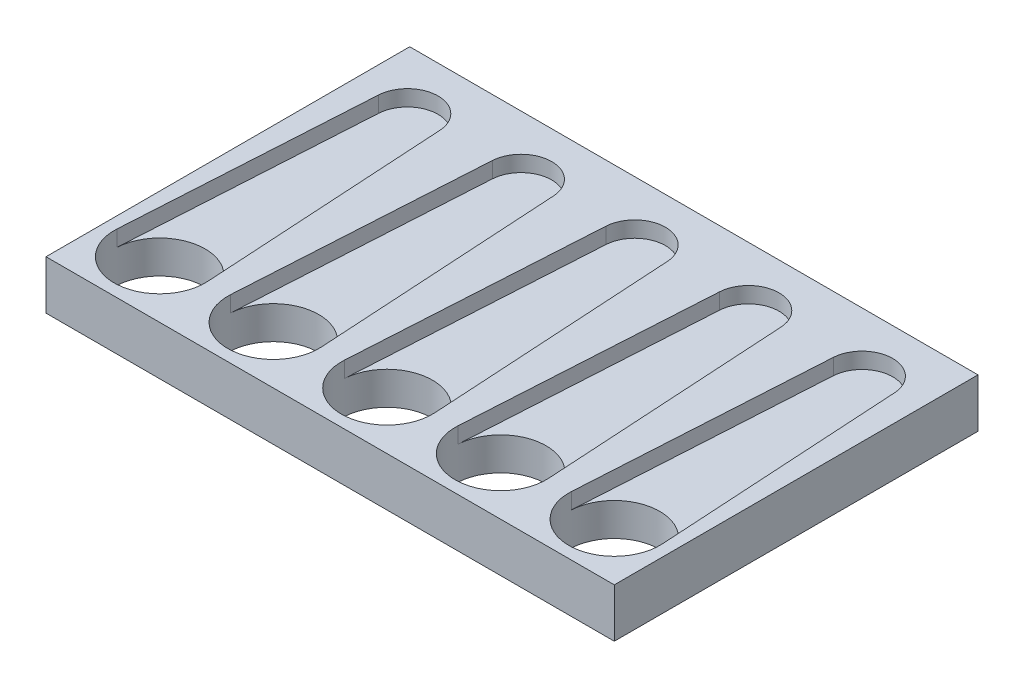
ISO-10303-21;
HEADER;
FILE_DESCRIPTION(('STEP AP214'),'2;1');
FILE_NAME('part.step','',(''),(''),'','','');
FILE_SCHEMA(('AUTOMOTIVE_DESIGN { 1 0 10303 214 1 1 1 1 }'));
ENDSEC;
DATA;
#1=APPLICATION_CONTEXT('core data for automotive mechanical design processes');
#2=APPLICATION_PROTOCOL_DEFINITION('international standard','automotive_design',2000,#1);
#3=PRODUCT_CONTEXT('',#1,'mechanical');
#4=PRODUCT('Part','Part','',(#3));
#5=PRODUCT_RELATED_PRODUCT_CATEGORY('part','',(#4));
#6=PRODUCT_DEFINITION_FORMATION('','',#4);
#7=PRODUCT_DEFINITION_CONTEXT('part definition',#1,'design');
#8=PRODUCT_DEFINITION('design','',#6,#7);
#9=PRODUCT_DEFINITION_SHAPE('','',#8);
#10=(LENGTH_UNIT() NAMED_UNIT(*) SI_UNIT(.MILLI.,.METRE.));
#11=(NAMED_UNIT(*) PLANE_ANGLE_UNIT() SI_UNIT($,.RADIAN.));
#12=(NAMED_UNIT(*) SI_UNIT($,.STERADIAN.) SOLID_ANGLE_UNIT());
#13=UNCERTAINTY_MEASURE_WITH_UNIT(LENGTH_MEASURE(1.E-05),#10,'distance_accuracy_value','');
#14=(GEOMETRIC_REPRESENTATION_CONTEXT(3) GLOBAL_UNCERTAINTY_ASSIGNED_CONTEXT((#13)) GLOBAL_UNIT_ASSIGNED_CONTEXT((#10,
#11,#12)) REPRESENTATION_CONTEXT('',''));
#15=CARTESIAN_POINT('',(0.,0.,0.));
#16=DIRECTION('',(0.,0.,1.));
#17=DIRECTION('',(1.,0.,0.));
#18=AXIS2_PLACEMENT_3D('',#15,#16,#17);
#19=CARTESIAN_POINT('',(0.,1.4,0.));
#20=DIRECTION('',(0.,0.,-1.));
#21=DIRECTION('',(-1.,0.,0.));
#22=AXIS2_PLACEMENT_3D('',#19,#20,#21);
#23=PLANE('',#22);
#24=DIRECTION('',(1.,0.,0.));
#25=VECTOR('',#24,1.);
#26=CARTESIAN_POINT('',(0.,-2.9,0.));
#27=LINE('',#26,#25);
#28=CARTESIAN_POINT('',(0.,-2.9,0.));
#29=VERTEX_POINT('',#28);
#30=CARTESIAN_POINT('',(50.,-2.9,0.));
#31=VERTEX_POINT('',#30);
#32=EDGE_CURVE('E207',#29,#31,#27,.T.);
#33=ORIENTED_EDGE('',*,*,#32,.T.);
#34=DIRECTION('',(0.,-1.,0.));
#35=VECTOR('',#34,1.);
#36=CARTESIAN_POINT('',(50.,1.4,0.));
#37=LINE('',#36,#35);
#38=CARTESIAN_POINT('',(50.,1.4,0.));
#39=VERTEX_POINT('',#38);
#40=EDGE_CURVE('E211',#39,#31,#37,.T.);
#41=ORIENTED_EDGE('',*,*,#40,.F.);
#42=DIRECTION('',(1.,0.,0.));
#43=VECTOR('',#42,1.);
#44=CARTESIAN_POINT('',(0.,1.4,0.));
#45=LINE('',#44,#43);
#46=CARTESIAN_POINT('',(0.,1.4,0.));
#47=VERTEX_POINT('',#46);
#48=EDGE_CURVE('E465',#47,#39,#45,.T.);
#49=ORIENTED_EDGE('',*,*,#48,.F.);
#50=DIRECTION('',(0.,-1.,0.));
#51=VECTOR('',#50,1.);
#52=CARTESIAN_POINT('',(0.,1.4,0.));
#53=LINE('',#52,#51);
#54=EDGE_CURVE('E61',#47,#29,#53,.T.);
#55=ORIENTED_EDGE('',*,*,#54,.T.);
#56=EDGE_LOOP('',(#33,#41,#49,#55));
#57=FACE_BOUND('',#56,.T.);
#58=ADVANCED_FACE('F51',(#57),#23,.F.);
#59=CARTESIAN_POINT('',(0.,1.4,-32.));
#60=DIRECTION('',(0.,0.,-1.));
#61=DIRECTION('',(-1.,0.,0.));
#62=AXIS2_PLACEMENT_3D('',#59,#60,#61);
#63=PLANE('',#62);
#64=DIRECTION('',(0.,-1.,0.));
#65=VECTOR('',#64,1.);
#66=CARTESIAN_POINT('',(50.,1.4,-32.));
#67=LINE('',#66,#65);
#68=CARTESIAN_POINT('',(50.,1.4,-32.));
#69=VERTEX_POINT('',#68);
#70=CARTESIAN_POINT('',(50.,-2.9,-32.));
#71=VERTEX_POINT('',#70);
#72=EDGE_CURVE('E228',#69,#71,#67,.T.);
#73=ORIENTED_EDGE('',*,*,#72,.T.);
#74=DIRECTION('',(1.,0.,0.));
#75=VECTOR('',#74,1.);
#76=CARTESIAN_POINT('',(0.,-2.9,-32.));
#77=LINE('',#76,#75);
#78=CARTESIAN_POINT('',(0.,-2.9,-32.));
#79=VERTEX_POINT('',#78);
#80=EDGE_CURVE('E216',#79,#71,#77,.T.);
#81=ORIENTED_EDGE('',*,*,#80,.F.);
#82=DIRECTION('',(0.,-1.,0.));
#83=VECTOR('',#82,1.);
#84=CARTESIAN_POINT('',(0.,1.4,-32.));
#85=LINE('',#84,#83);
#86=CARTESIAN_POINT('',(0.,1.4,-32.));
#87=VERTEX_POINT('',#86);
#88=EDGE_CURVE('E11',#87,#79,#85,.T.);
#89=ORIENTED_EDGE('',*,*,#88,.F.);
#90=DIRECTION('',(1.,0.,0.));
#91=VECTOR('',#90,1.);
#92=CARTESIAN_POINT('',(0.,1.4,-32.));
#93=LINE('',#92,#91);
#94=EDGE_CURVE('E466',#87,#69,#93,.T.);
#95=ORIENTED_EDGE('',*,*,#94,.T.);
#96=EDGE_LOOP('',(#73,#81,#89,#95));
#97=FACE_BOUND('',#96,.T.);
#98=ADVANCED_FACE('F565',(#97),#63,.T.);
#99=CARTESIAN_POINT('',(5.,1.4,-26.8));
#100=DIRECTION('',(0.,-1.,0.));
#101=DIRECTION('',(0.,0.,-1.));
#102=AXIS2_PLACEMENT_3D('',#99,#100,#101);
#103=CYLINDRICAL_SURFACE('',#102,2.7);
#104=CARTESIAN_POINT('',(5.,0.,-26.8));
#105=DIRECTION('',(0.,1.,0.));
#106=DIRECTION('',(0.,0.,1.));
#107=AXIS2_PLACEMENT_3D('',#104,#105,#106);
#108=CIRCLE('',#107,2.7);
#109=CARTESIAN_POINT('',(7.69519499216427,0.,-26.9610091743119));
#110=VERTEX_POINT('',#109);
#111=CARTESIAN_POINT('',(2.30480500783572,0.,-26.9610091743119));
#112=VERTEX_POINT('',#111);
#113=EDGE_CURVE('E441',#110,#112,#108,.T.);
#114=ORIENTED_EDGE('',*,*,#113,.F.);
#115=DIRECTION('',(0.,-1.,0.));
#116=VECTOR('',#115,1.);
#117=CARTESIAN_POINT('',(7.69519499216427,1.4,-26.9610091743119));
#118=LINE('',#117,#116);
#119=CARTESIAN_POINT('',(7.69519499216427,1.4,-26.9610091743119));
#120=VERTEX_POINT('',#119);
#121=EDGE_CURVE('E54',#120,#110,#118,.T.);
#122=ORIENTED_EDGE('',*,*,#121,.F.);
#123=CARTESIAN_POINT('',(5.,1.4,-26.8));
#124=DIRECTION('',(0.,1.,0.));
#125=DIRECTION('',(0.,0.,1.));
#126=AXIS2_PLACEMENT_3D('',#123,#124,#125);
#127=CIRCLE('',#126,2.7);
#128=CARTESIAN_POINT('',(2.30480500783572,1.4,-26.9610091743119));
#129=VERTEX_POINT('',#128);
#130=EDGE_CURVE('E446',#120,#129,#127,.T.);
#131=ORIENTED_EDGE('',*,*,#130,.T.);
#132=DIRECTION('',(0.,-1.,0.));
#133=VECTOR('',#132,1.);
#134=CARTESIAN_POINT('',(2.30480500783572,1.4,-26.9610091743119));
#135=LINE('',#134,#133);
#136=EDGE_CURVE('E472',#129,#112,#135,.T.);
#137=ORIENTED_EDGE('',*,*,#136,.T.);
#138=EDGE_LOOP('',(#114,#122,#131,#137));
#139=FACE_BOUND('',#138,.T.);
#140=ADVANCED_FACE('F52',(#139),#103,.F.);
#141=CARTESIAN_POINT('',(9.27273549325119,1.4,-0.553947113185445));
#142=DIRECTION('',(0.99822036746825,0.,-0.0596330275229358));
#143=DIRECTION('',(-0.0596330275229358,0.,-0.99822036746825));
#144=AXIS2_PLACEMENT_3D('',#141,#142,#143);
#145=PLANE('',#144);
#146=DIRECTION('',(0.0596330275229358,0.,0.99822036746825));
#147=VECTOR('',#146,1.);
#148=CARTESIAN_POINT('',(9.27273549325119,0.,-0.553947113185445));
#149=LINE('',#148,#147);
#150=CARTESIAN_POINT('',(8.992881469873,0.,-5.23853211009174));
#151=VERTEX_POINT('',#150);
#152=EDGE_CURVE('E474',#110,#151,#149,.T.);
#153=ORIENTED_EDGE('',*,*,#152,.T.);
#154=DIRECTION('',(0.,-1.,0.));
#155=VECTOR('',#154,1.);
#156=CARTESIAN_POINT('',(8.992881469873,1.4,-5.23853211009174));
#157=LINE('',#156,#155);
#158=CARTESIAN_POINT('',(8.992881469873,1.4,-5.23853211009174));
#159=VERTEX_POINT('',#158);
#160=EDGE_CURVE('E487',#159,#151,#157,.T.);
#161=ORIENTED_EDGE('',*,*,#160,.F.);
#162=DIRECTION('',(0.0596330275229358,0.,0.99822036746825));
#163=VECTOR('',#162,1.);
#164=CARTESIAN_POINT('',(9.27273549325119,1.4,-0.553947113185445));
#165=LINE('',#164,#163);
#166=EDGE_CURVE('E451',#120,#159,#165,.T.);
#167=ORIENTED_EDGE('',*,*,#166,.F.);
#168=ORIENTED_EDGE('',*,*,#121,.T.);
#169=EDGE_LOOP('',(#153,#161,#167,#168));
#170=FACE_BOUND('',#169,.T.);
#171=ADVANCED_FACE('F504',(#170),#145,.F.);
#172=CARTESIAN_POINT('',(5.,1.4,-5.));
#173=DIRECTION('',(0.,-1.,0.));
#174=DIRECTION('',(0.,0.,-1.));
#175=AXIS2_PLACEMENT_3D('',#172,#173,#174);
#176=CYLINDRICAL_SURFACE('',#175,4.);
#177=ORIENTED_EDGE('',*,*,#160,.T.);
#178=CARTESIAN_POINT('',(5.,0.,-5.));
#179=DIRECTION('',(0.,1.,0.));
#180=DIRECTION('',(0.,0.,1.));
#181=AXIS2_PLACEMENT_3D('',#178,#179,#180);
#182=CIRCLE('',#181,4.);
#183=CARTESIAN_POINT('',(1.007118530127,0.,-5.23853211009174));
#184=VERTEX_POINT('',#183);
#185=EDGE_CURVE('E434',#151,#184,#182,.T.);
#186=ORIENTED_EDGE('',*,*,#185,.T.);
#187=DIRECTION('',(0.,-1.,0.));
#188=VECTOR('',#187,1.);
#189=CARTESIAN_POINT('',(1.007118530127,1.4,-5.23853211009174));
#190=LINE('',#189,#188);
#191=CARTESIAN_POINT('',(1.007118530127,1.4,-5.23853211009174));
#192=VERTEX_POINT('',#191);
#193=EDGE_CURVE('E486',#192,#184,#190,.T.);
#194=ORIENTED_EDGE('',*,*,#193,.F.);
#195=CARTESIAN_POINT('',(5.,1.4,-5.));
#196=DIRECTION('',(0.,1.,0.));
#197=DIRECTION('',(0.,0.,1.));
#198=AXIS2_PLACEMENT_3D('',#195,#196,#197);
#199=CIRCLE('',#198,4.);
#200=EDGE_CURVE('E454',#192,#159,#199,.T.);
#201=ORIENTED_EDGE('',*,*,#200,.T.);
#202=EDGE_LOOP('',(#177,#186,#194,#201));
#203=FACE_BOUND('',#202,.T.);
#204=CARTESIAN_POINT('',(5.,-2.9,-5.));
#205=DIRECTION('',(0.,1.,0.));
#206=DIRECTION('',(0.,0.,1.));
#207=AXIS2_PLACEMENT_3D('',#204,#205,#206);
#208=CIRCLE('',#207,4.);
#209=CARTESIAN_POINT('',(5.,-2.9,-0.999999999999999));
#210=VERTEX_POINT('',#209);
#211=EDGE_CURVE('E220',#210,#210,#208,.T.);
#212=ORIENTED_EDGE('',*,*,#211,.F.);
#213=EDGE_LOOP('',(#212));
#214=FACE_BOUND('',#213,.T.);
#215=ADVANCED_FACE('F508',(#203,#214),#176,.F.);
#216=CARTESIAN_POINT('',(0.691703527033296,1.4,0.0413219132864469));
#217=DIRECTION('',(0.99822036746825,0.,0.0596330275229357));
#218=DIRECTION('',(0.0596330275229357,0.,-0.99822036746825));
#219=AXIS2_PLACEMENT_3D('',#216,#217,#218);
#220=PLANE('',#219);
#221=DIRECTION('',(-0.0596330275229357,0.,0.99822036746825));
#222=VECTOR('',#221,1.);
#223=CARTESIAN_POINT('',(0.691703527033296,0.,0.0413219132864469));
#224=LINE('',#223,#222);
#225=EDGE_CURVE('E455',#112,#184,#224,.T.);
#226=ORIENTED_EDGE('',*,*,#225,.F.);
#227=ORIENTED_EDGE('',*,*,#136,.F.);
#228=DIRECTION('',(-0.0596330275229357,0.,0.99822036746825));
#229=VECTOR('',#228,1.);
#230=CARTESIAN_POINT('',(0.691703527033296,1.4,0.0413219132864469));
#231=LINE('',#230,#229);
#232=EDGE_CURVE('E459',#129,#192,#231,.T.);
#233=ORIENTED_EDGE('',*,*,#232,.T.);
#234=ORIENTED_EDGE('',*,*,#193,.T.);
#235=EDGE_LOOP('',(#226,#227,#233,#234));
#236=FACE_BOUND('',#235,.T.);
#237=ADVANCED_FACE('F515',(#236),#220,.T.);
#238=CARTESIAN_POINT('',(0.,1.4,0.));
#239=DIRECTION('',(-1.,0.,0.));
#240=DIRECTION('',(0.,0.,1.));
#241=AXIS2_PLACEMENT_3D('',#238,#239,#240);
#242=PLANE('',#241);
#243=ORIENTED_EDGE('',*,*,#88,.T.);
#244=DIRECTION('',(0.,0.,-1.));
#245=VECTOR('',#244,1.);
#246=CARTESIAN_POINT('',(0.,-2.9,0.));
#247=LINE('',#246,#245);
#248=EDGE_CURVE('E442',#29,#79,#247,.T.);
#249=ORIENTED_EDGE('',*,*,#248,.F.);
#250=ORIENTED_EDGE('',*,*,#54,.F.);
#251=DIRECTION('',(0.,0.,-1.));
#252=VECTOR('',#251,1.);
#253=CARTESIAN_POINT('',(0.,1.4,0.));
#254=LINE('',#253,#252);
#255=EDGE_CURVE('E467',#47,#87,#254,.T.);
#256=ORIENTED_EDGE('',*,*,#255,.T.);
#257=EDGE_LOOP('',(#243,#249,#250,#256));
#258=FACE_BOUND('',#257,.T.);
#259=ADVANCED_FACE('F520',(#258),#242,.T.);
#260=CARTESIAN_POINT('',(0.,1.4,0.));
#261=DIRECTION('',(0.,1.,0.));
#262=DIRECTION('',(0.,0.,1.));
#263=AXIS2_PLACEMENT_3D('',#260,#261,#262);
#264=PLANE('',#263);
#265=ORIENTED_EDGE('',*,*,#130,.F.);
#266=ORIENTED_EDGE('',*,*,#166,.T.);
#267=ORIENTED_EDGE('',*,*,#200,.F.);
#268=ORIENTED_EDGE('',*,*,#232,.F.);
#269=EDGE_LOOP('',(#265,#266,#267,#268));
#270=FACE_BOUND('',#269,.T.);
#271=ORIENTED_EDGE('',*,*,#48,.T.);
#272=DIRECTION('',(0.,0.,-1.));
#273=VECTOR('',#272,1.);
#274=CARTESIAN_POINT('',(50.,1.4,0.));
#275=LINE('',#274,#273);
#276=EDGE_CURVE('E229',#39,#69,#275,.T.);
#277=ORIENTED_EDGE('',*,*,#276,.T.);
#278=ORIENTED_EDGE('',*,*,#94,.F.);
#279=ORIENTED_EDGE('',*,*,#255,.F.);
#280=EDGE_LOOP('',(#271,#277,#278,#279));
#281=FACE_BOUND('',#280,.T.);
#282=CARTESIAN_POINT('',(15.,1.4,-26.8));
#283=DIRECTION('',(0.,1.,0.));
#284=DIRECTION('',(0.,0.,1.));
#285=AXIS2_PLACEMENT_3D('',#282,#283,#284);
#286=CIRCLE('',#285,2.7);
#287=CARTESIAN_POINT('',(17.6951949921643,1.4,-26.9610091743119));
#288=VERTEX_POINT('',#287);
#289=CARTESIAN_POINT('',(12.3048050078357,1.4,-26.9610091743119));
#290=VERTEX_POINT('',#289);
#291=EDGE_CURVE('E396',#288,#290,#286,.T.);
#292=ORIENTED_EDGE('',*,*,#291,.F.);
#293=DIRECTION('',(0.0596330275229358,0.,0.99822036746825));
#294=VECTOR('',#293,1.);
#295=CARTESIAN_POINT('',(19.2727354932512,1.4,-0.553947113185445));
#296=LINE('',#295,#294);
#297=CARTESIAN_POINT('',(18.992881469873,1.4,-5.23853211009174));
#298=VERTEX_POINT('',#297);
#299=EDGE_CURVE('E399',#288,#298,#296,.T.);
#300=ORIENTED_EDGE('',*,*,#299,.T.);
#301=CARTESIAN_POINT('',(15.,1.4,-5.));
#302=DIRECTION('',(0.,1.,0.));
#303=DIRECTION('',(0.,0.,1.));
#304=AXIS2_PLACEMENT_3D('',#301,#302,#303);
#305=CIRCLE('',#304,4.);
#306=CARTESIAN_POINT('',(11.007118530127,1.4,-5.23853211009174));
#307=VERTEX_POINT('',#306);
#308=EDGE_CURVE('E404',#307,#298,#305,.T.);
#309=ORIENTED_EDGE('',*,*,#308,.F.);
#310=DIRECTION('',(-0.0596330275229357,0.,0.99822036746825));
#311=VECTOR('',#310,1.);
#312=CARTESIAN_POINT('',(10.6917035270333,1.4,0.0413219132864469));
#313=LINE('',#312,#311);
#314=EDGE_CURVE('E410',#290,#307,#313,.T.);
#315=ORIENTED_EDGE('',*,*,#314,.F.);
#316=EDGE_LOOP('',(#292,#300,#309,#315));
#317=FACE_BOUND('',#316,.T.);
#318=CARTESIAN_POINT('',(25.,1.4,-26.8));
#319=DIRECTION('',(0.,1.,0.));
#320=DIRECTION('',(0.,0.,1.));
#321=AXIS2_PLACEMENT_3D('',#318,#319,#320);
#322=CIRCLE('',#321,2.7);
#323=CARTESIAN_POINT('',(27.6951949921643,1.4,-26.9610091743119));
#324=VERTEX_POINT('',#323);
#325=CARTESIAN_POINT('',(22.3048050078357,1.4,-26.9610091743119));
#326=VERTEX_POINT('',#325);
#327=EDGE_CURVE('E356',#324,#326,#322,.T.);
#328=ORIENTED_EDGE('',*,*,#327,.F.);
#329=DIRECTION('',(0.0596330275229358,0.,0.99822036746825));
#330=VECTOR('',#329,1.);
#331=CARTESIAN_POINT('',(29.2727354932512,1.4,-0.553947113185445));
#332=LINE('',#331,#330);
#333=CARTESIAN_POINT('',(28.992881469873,1.4,-5.23853211009174));
#334=VERTEX_POINT('',#333);
#335=EDGE_CURVE('E359',#324,#334,#332,.T.);
#336=ORIENTED_EDGE('',*,*,#335,.T.);
#337=CARTESIAN_POINT('',(25.,1.4,-5.));
#338=DIRECTION('',(0.,1.,0.));
#339=DIRECTION('',(0.,0.,1.));
#340=AXIS2_PLACEMENT_3D('',#337,#338,#339);
#341=CIRCLE('',#340,4.);
#342=CARTESIAN_POINT('',(21.007118530127,1.4,-5.23853211009174));
#343=VERTEX_POINT('',#342);
#344=EDGE_CURVE('E365',#343,#334,#341,.T.);
#345=ORIENTED_EDGE('',*,*,#344,.F.);
#346=DIRECTION('',(-0.0596330275229357,0.,0.99822036746825));
#347=VECTOR('',#346,1.);
#348=CARTESIAN_POINT('',(20.6917035270333,1.4,0.0413219132864469));
#349=LINE('',#348,#347);
#350=EDGE_CURVE('E366',#326,#343,#349,.T.);
#351=ORIENTED_EDGE('',*,*,#350,.F.);
#352=EDGE_LOOP('',(#328,#336,#345,#351));
#353=FACE_BOUND('',#352,.T.);
#354=CARTESIAN_POINT('',(35.,1.4,-26.8));
#355=DIRECTION('',(0.,1.,0.));
#356=DIRECTION('',(0.,0.,1.));
#357=AXIS2_PLACEMENT_3D('',#354,#355,#356);
#358=CIRCLE('',#357,2.7);
#359=CARTESIAN_POINT('',(37.6951949921643,1.4,-26.9610091743119));
#360=VERTEX_POINT('',#359);
#361=CARTESIAN_POINT('',(32.3048050078357,1.4,-26.9610091743119));
#362=VERTEX_POINT('',#361);
#363=EDGE_CURVE('E316',#360,#362,#358,.T.);
#364=ORIENTED_EDGE('',*,*,#363,.F.);
#365=DIRECTION('',(0.0596330275229358,0.,0.99822036746825));
#366=VECTOR('',#365,1.);
#367=CARTESIAN_POINT('',(39.2727354932512,1.4,-0.553947113185445));
#368=LINE('',#367,#366);
#369=CARTESIAN_POINT('',(38.992881469873,1.4,-5.23853211009174));
#370=VERTEX_POINT('',#369);
#371=EDGE_CURVE('E319',#360,#370,#368,.T.);
#372=ORIENTED_EDGE('',*,*,#371,.T.);
#373=CARTESIAN_POINT('',(35.,1.4,-5.));
#374=DIRECTION('',(0.,1.,0.));
#375=DIRECTION('',(0.,0.,1.));
#376=AXIS2_PLACEMENT_3D('',#373,#374,#375);
#377=CIRCLE('',#376,4.);
#378=CARTESIAN_POINT('',(31.007118530127,1.4,-5.23853211009174));
#379=VERTEX_POINT('',#378);
#380=EDGE_CURVE('E322',#379,#370,#377,.T.);
#381=ORIENTED_EDGE('',*,*,#380,.F.);
#382=DIRECTION('',(-0.0596330275229357,0.,0.99822036746825));
#383=VECTOR('',#382,1.);
#384=CARTESIAN_POINT('',(30.6917035270333,1.4,0.0413219132864469));
#385=LINE('',#384,#383);
#386=EDGE_CURVE('E327',#362,#379,#385,.T.);
#387=ORIENTED_EDGE('',*,*,#386,.F.);
#388=EDGE_LOOP('',(#364,#372,#381,#387));
#389=FACE_BOUND('',#388,.T.);
#390=CARTESIAN_POINT('',(45.,1.4,-26.8));
#391=DIRECTION('',(0.,1.,0.));
#392=DIRECTION('',(0.,0.,1.));
#393=AXIS2_PLACEMENT_3D('',#390,#391,#392);
#394=CIRCLE('',#393,2.7);
#395=CARTESIAN_POINT('',(47.6951949921643,1.4,-26.9610091743119));
#396=VERTEX_POINT('',#395);
#397=CARTESIAN_POINT('',(42.3048050078357,1.4,-26.9610091743119));
#398=VERTEX_POINT('',#397);
#399=EDGE_CURVE('E272',#396,#398,#394,.T.);
#400=ORIENTED_EDGE('',*,*,#399,.F.);
#401=DIRECTION('',(0.0596330275229358,0.,0.99822036746825));
#402=VECTOR('',#401,1.);
#403=CARTESIAN_POINT('',(49.2727354932512,1.4,-0.553947113185445));
#404=LINE('',#403,#402);
#405=CARTESIAN_POINT('',(48.992881469873,1.4,-5.23853211009174));
#406=VERTEX_POINT('',#405);
#407=EDGE_CURVE('E280',#396,#406,#404,.T.);
#408=ORIENTED_EDGE('',*,*,#407,.T.);
#409=CARTESIAN_POINT('',(45.,1.4,-5.));
#410=DIRECTION('',(0.,1.,0.));
#411=DIRECTION('',(0.,0.,1.));
#412=AXIS2_PLACEMENT_3D('',#409,#410,#411);
#413=CIRCLE('',#412,4.);
#414=CARTESIAN_POINT('',(41.007118530127,1.4,-5.23853211009174));
#415=VERTEX_POINT('',#414);
#416=EDGE_CURVE('E284',#415,#406,#413,.T.);
#417=ORIENTED_EDGE('',*,*,#416,.F.);
#418=DIRECTION('',(-0.0596330275229357,0.,0.99822036746825));
#419=VECTOR('',#418,1.);
#420=CARTESIAN_POINT('',(40.6917035270333,1.4,0.0413219132864469));
#421=LINE('',#420,#419);
#422=EDGE_CURVE('E282',#398,#415,#421,.T.);
#423=ORIENTED_EDGE('',*,*,#422,.F.);
#424=EDGE_LOOP('',(#400,#408,#417,#423));
#425=FACE_BOUND('',#424,.T.);
#426=ADVANCED_FACE('F513',(#270,#281,#317,#353,#389,#425),#264,.T.);
#427=CARTESIAN_POINT('',(0.,-2.9,0.));
#428=DIRECTION('',(0.,1.,0.));
#429=DIRECTION('',(0.,0.,1.));
#430=AXIS2_PLACEMENT_3D('',#427,#428,#429);
#431=PLANE('',#430);
#432=ORIENTED_EDGE('',*,*,#211,.T.);
#433=EDGE_LOOP('',(#432));
#434=FACE_BOUND('',#433,.T.);
#435=ORIENTED_EDGE('',*,*,#32,.F.);
#436=ORIENTED_EDGE('',*,*,#248,.T.);
#437=ORIENTED_EDGE('',*,*,#80,.T.);
#438=DIRECTION('',(0.,0.,-1.));
#439=VECTOR('',#438,1.);
#440=CARTESIAN_POINT('',(50.,-2.9,0.));
#441=LINE('',#440,#439);
#442=EDGE_CURVE('E221',#31,#71,#441,.T.);
#443=ORIENTED_EDGE('',*,*,#442,.F.);
#444=EDGE_LOOP('',(#435,#436,#437,#443));
#445=FACE_BOUND('',#444,.T.);
#446=CARTESIAN_POINT('',(15.,-2.9,-5.));
#447=DIRECTION('',(0.,1.,0.));
#448=DIRECTION('',(0.,0.,1.));
#449=AXIS2_PLACEMENT_3D('',#446,#447,#448);
#450=CIRCLE('',#449,4.);
#451=CARTESIAN_POINT('',(15.,-2.9,-0.999999999999999));
#452=VERTEX_POINT('',#451);
#453=EDGE_CURVE('E264',#452,#452,#450,.T.);
#454=ORIENTED_EDGE('',*,*,#453,.T.);
#455=EDGE_LOOP('',(#454));
#456=FACE_BOUND('',#455,.T.);
#457=CARTESIAN_POINT('',(25.,-2.9,-5.));
#458=DIRECTION('',(0.,1.,0.));
#459=DIRECTION('',(0.,0.,1.));
#460=AXIS2_PLACEMENT_3D('',#457,#458,#459);
#461=CIRCLE('',#460,4.);
#462=CARTESIAN_POINT('',(25.,-2.9,-0.999999999999999));
#463=VERTEX_POINT('',#462);
#464=EDGE_CURVE('E260',#463,#463,#461,.T.);
#465=ORIENTED_EDGE('',*,*,#464,.T.);
#466=EDGE_LOOP('',(#465));
#467=FACE_BOUND('',#466,.T.);
#468=CARTESIAN_POINT('',(35.,-2.9,-5.));
#469=DIRECTION('',(0.,1.,0.));
#470=DIRECTION('',(0.,0.,1.));
#471=AXIS2_PLACEMENT_3D('',#468,#469,#470);
#472=CIRCLE('',#471,4.);
#473=CARTESIAN_POINT('',(35.,-2.9,-0.999999999999999));
#474=VERTEX_POINT('',#473);
#475=EDGE_CURVE('E243',#474,#474,#472,.T.);
#476=ORIENTED_EDGE('',*,*,#475,.T.);
#477=EDGE_LOOP('',(#476));
#478=FACE_BOUND('',#477,.T.);
#479=CARTESIAN_POINT('',(45.,-2.9,-5.));
#480=DIRECTION('',(0.,1.,0.));
#481=DIRECTION('',(0.,0.,1.));
#482=AXIS2_PLACEMENT_3D('',#479,#480,#481);
#483=CIRCLE('',#482,4.);
#484=CARTESIAN_POINT('',(45.,-2.9,-0.999999999999999));
#485=VERTEX_POINT('',#484);
#486=EDGE_CURVE('E240',#485,#485,#483,.T.);
#487=ORIENTED_EDGE('',*,*,#486,.T.);
#488=EDGE_LOOP('',(#487));
#489=FACE_BOUND('',#488,.T.);
#490=ADVANCED_FACE('F231',(#434,#445,#456,#467,#478,#489),#431,.F.);
#491=CARTESIAN_POINT('',(0.,0.,0.));
#492=DIRECTION('',(0.,1.,0.));
#493=DIRECTION('',(0.,0.,1.));
#494=AXIS2_PLACEMENT_3D('',#491,#492,#493);
#495=PLANE('',#494);
#496=ORIENTED_EDGE('',*,*,#113,.T.);
#497=ORIENTED_EDGE('',*,*,#225,.T.);
#498=ORIENTED_EDGE('',*,*,#185,.F.);
#499=ORIENTED_EDGE('',*,*,#152,.F.);
#500=EDGE_LOOP('',(#496,#497,#498,#499));
#501=FACE_BOUND('',#500,.T.);
#502=ADVANCED_FACE('F506',(#501),#495,.T.);
#503=CARTESIAN_POINT('',(15.,1.4,-26.8));
#504=DIRECTION('',(0.,-1.,0.));
#505=DIRECTION('',(0.,0.,-1.));
#506=AXIS2_PLACEMENT_3D('',#503,#504,#505);
#507=CYLINDRICAL_SURFACE('',#506,2.7);
#508=CARTESIAN_POINT('',(15.,0.,-26.8));
#509=DIRECTION('',(0.,1.,0.));
#510=DIRECTION('',(0.,0.,1.));
#511=AXIS2_PLACEMENT_3D('',#508,#509,#510);
#512=CIRCLE('',#511,2.7);
#513=CARTESIAN_POINT('',(17.6951949921643,0.,-26.9610091743119));
#514=VERTEX_POINT('',#513);
#515=CARTESIAN_POINT('',(12.3048050078357,0.,-26.9610091743119));
#516=VERTEX_POINT('',#515);
#517=EDGE_CURVE('E392',#514,#516,#512,.T.);
#518=ORIENTED_EDGE('',*,*,#517,.F.);
#519=DIRECTION('',(0.,-1.,0.));
#520=VECTOR('',#519,1.);
#521=CARTESIAN_POINT('',(17.6951949921643,1.4,-26.9610091743119));
#522=LINE('',#521,#520);
#523=EDGE_CURVE('E435',#288,#514,#522,.T.);
#524=ORIENTED_EDGE('',*,*,#523,.F.);
#525=ORIENTED_EDGE('',*,*,#291,.T.);
#526=DIRECTION('',(0.,-1.,0.));
#527=VECTOR('',#526,1.);
#528=CARTESIAN_POINT('',(12.3048050078357,1.4,-26.9610091743119));
#529=LINE('',#528,#527);
#530=EDGE_CURVE('E415',#290,#516,#529,.T.);
#531=ORIENTED_EDGE('',*,*,#530,.T.);
#532=EDGE_LOOP('',(#518,#524,#525,#531));
#533=FACE_BOUND('',#532,.T.);
#534=ADVANCED_FACE('F609',(#533),#507,.F.);
#535=CARTESIAN_POINT('',(19.2727354932512,1.4,-0.553947113185445));
#536=DIRECTION('',(0.99822036746825,0.,-0.0596330275229358));
#537=DIRECTION('',(-0.0596330275229358,0.,-0.99822036746825));
#538=AXIS2_PLACEMENT_3D('',#535,#536,#537);
#539=PLANE('',#538);
#540=DIRECTION('',(0.0596330275229358,0.,0.99822036746825));
#541=VECTOR('',#540,1.);
#542=CARTESIAN_POINT('',(19.2727354932512,0.,-0.553947113185445));
#543=LINE('',#542,#541);
#544=CARTESIAN_POINT('',(18.992881469873,0.,-5.23853211009174));
#545=VERTEX_POINT('',#544);
#546=EDGE_CURVE('E418',#514,#545,#543,.T.);
#547=ORIENTED_EDGE('',*,*,#546,.T.);
#548=DIRECTION('',(0.,-1.,0.));
#549=VECTOR('',#548,1.);
#550=CARTESIAN_POINT('',(18.992881469873,1.4,-5.23853211009174));
#551=LINE('',#550,#549);
#552=EDGE_CURVE('E427',#298,#545,#551,.T.);
#553=ORIENTED_EDGE('',*,*,#552,.F.);
#554=ORIENTED_EDGE('',*,*,#299,.F.);
#555=ORIENTED_EDGE('',*,*,#523,.T.);
#556=EDGE_LOOP('',(#547,#553,#554,#555));
#557=FACE_BOUND('',#556,.T.);
#558=ADVANCED_FACE('F611',(#557),#539,.F.);
#559=CARTESIAN_POINT('',(15.,1.4,-5.));
#560=DIRECTION('',(0.,-1.,0.));
#561=DIRECTION('',(0.,0.,-1.));
#562=AXIS2_PLACEMENT_3D('',#559,#560,#561);
#563=CYLINDRICAL_SURFACE('',#562,4.);
#564=ORIENTED_EDGE('',*,*,#552,.T.);
#565=CARTESIAN_POINT('',(15.,0.,-5.));
#566=DIRECTION('',(0.,1.,0.));
#567=DIRECTION('',(0.,0.,1.));
#568=AXIS2_PLACEMENT_3D('',#565,#566,#567);
#569=CIRCLE('',#568,4.);
#570=CARTESIAN_POINT('',(11.007118530127,0.,-5.23853211009174));
#571=VERTEX_POINT('',#570);
#572=EDGE_CURVE('E261',#545,#571,#569,.T.);
#573=ORIENTED_EDGE('',*,*,#572,.T.);
#574=DIRECTION('',(0.,-1.,0.));
#575=VECTOR('',#574,1.);
#576=CARTESIAN_POINT('',(11.007118530127,1.4,-5.23853211009174));
#577=LINE('',#576,#575);
#578=EDGE_CURVE('E426',#307,#571,#577,.T.);
#579=ORIENTED_EDGE('',*,*,#578,.F.);
#580=ORIENTED_EDGE('',*,*,#308,.T.);
#581=EDGE_LOOP('',(#564,#573,#579,#580));
#582=FACE_BOUND('',#581,.T.);
#583=ORIENTED_EDGE('',*,*,#453,.F.);
#584=EDGE_LOOP('',(#583));
#585=FACE_BOUND('',#584,.T.);
#586=ADVANCED_FACE('F625',(#582,#585),#563,.F.);
#587=CARTESIAN_POINT('',(10.6917035270333,1.4,0.0413219132864469));
#588=DIRECTION('',(0.99822036746825,0.,0.0596330275229357));
#589=DIRECTION('',(0.0596330275229357,0.,-0.99822036746825));
#590=AXIS2_PLACEMENT_3D('',#587,#588,#589);
#591=PLANE('',#590);
#592=DIRECTION('',(-0.0596330275229357,0.,0.99822036746825));
#593=VECTOR('',#592,1.);
#594=CARTESIAN_POINT('',(10.6917035270333,0.,0.0413219132864469));
#595=LINE('',#594,#593);
#596=EDGE_CURVE('E402',#516,#571,#595,.T.);
#597=ORIENTED_EDGE('',*,*,#596,.F.);
#598=ORIENTED_EDGE('',*,*,#530,.F.);
#599=ORIENTED_EDGE('',*,*,#314,.T.);
#600=ORIENTED_EDGE('',*,*,#578,.T.);
#601=EDGE_LOOP('',(#597,#598,#599,#600));
#602=FACE_BOUND('',#601,.T.);
#603=ADVANCED_FACE('F635',(#602),#591,.T.);
#604=CARTESIAN_POINT('',(25.,1.4,-26.8));
#605=DIRECTION('',(0.,-1.,0.));
#606=DIRECTION('',(0.,0.,-1.));
#607=AXIS2_PLACEMENT_3D('',#604,#605,#606);
#608=CYLINDRICAL_SURFACE('',#607,2.7);
#609=CARTESIAN_POINT('',(25.,0.,-26.8));
#610=DIRECTION('',(0.,1.,0.));
#611=DIRECTION('',(0.,0.,1.));
#612=AXIS2_PLACEMENT_3D('',#609,#610,#611);
#613=CIRCLE('',#612,2.7);
#614=CARTESIAN_POINT('',(27.6951949921643,0.,-26.9610091743119));
#615=VERTEX_POINT('',#614);
#616=CARTESIAN_POINT('',(22.3048050078357,0.,-26.9610091743119));
#617=VERTEX_POINT('',#616);
#618=EDGE_CURVE('E352',#615,#617,#613,.T.);
#619=ORIENTED_EDGE('',*,*,#618,.F.);
#620=DIRECTION('',(0.,-1.,0.));
#621=VECTOR('',#620,1.);
#622=CARTESIAN_POINT('',(27.6951949921643,1.4,-26.9610091743119));
#623=LINE('',#622,#621);
#624=EDGE_CURVE('E391',#324,#615,#623,.T.);
#625=ORIENTED_EDGE('',*,*,#624,.F.);
#626=ORIENTED_EDGE('',*,*,#327,.T.);
#627=DIRECTION('',(0.,-1.,0.));
#628=VECTOR('',#627,1.);
#629=CARTESIAN_POINT('',(22.3048050078357,1.4,-26.9610091743119));
#630=LINE('',#629,#628);
#631=EDGE_CURVE('E375',#326,#617,#630,.T.);
#632=ORIENTED_EDGE('',*,*,#631,.T.);
#633=EDGE_LOOP('',(#619,#625,#626,#632));
#634=FACE_BOUND('',#633,.T.);
#635=ADVANCED_FACE('F645',(#634),#608,.F.);
#636=CARTESIAN_POINT('',(29.2727354932512,1.4,-0.553947113185445));
#637=DIRECTION('',(0.99822036746825,0.,-0.0596330275229358));
#638=DIRECTION('',(-0.0596330275229358,0.,-0.99822036746825));
#639=AXIS2_PLACEMENT_3D('',#636,#637,#638);
#640=PLANE('',#639);
#641=DIRECTION('',(0.0596330275229358,0.,0.99822036746825));
#642=VECTOR('',#641,1.);
#643=CARTESIAN_POINT('',(29.2727354932512,0.,-0.553947113185445));
#644=LINE('',#643,#642);
#645=CARTESIAN_POINT('',(28.992881469873,0.,-5.23853211009174));
#646=VERTEX_POINT('',#645);
#647=EDGE_CURVE('E376',#615,#646,#644,.T.);
#648=ORIENTED_EDGE('',*,*,#647,.T.);
#649=DIRECTION('',(0.,-1.,0.));
#650=VECTOR('',#649,1.);
#651=CARTESIAN_POINT('',(28.992881469873,1.4,-5.23853211009174));
#652=LINE('',#651,#650);
#653=EDGE_CURVE('E386',#334,#646,#652,.T.);
#654=ORIENTED_EDGE('',*,*,#653,.F.);
#655=ORIENTED_EDGE('',*,*,#335,.F.);
#656=ORIENTED_EDGE('',*,*,#624,.T.);
#657=EDGE_LOOP('',(#648,#654,#655,#656));
#658=FACE_BOUND('',#657,.T.);
#659=ADVANCED_FACE('F655',(#658),#640,.F.);
#660=CARTESIAN_POINT('',(25.,1.4,-5.));
#661=DIRECTION('',(0.,-1.,0.));
#662=DIRECTION('',(0.,0.,-1.));
#663=AXIS2_PLACEMENT_3D('',#660,#661,#662);
#664=CYLINDRICAL_SURFACE('',#663,4.);
#665=ORIENTED_EDGE('',*,*,#653,.T.);
#666=CARTESIAN_POINT('',(25.,0.,-5.));
#667=DIRECTION('',(0.,1.,0.));
#668=DIRECTION('',(0.,0.,1.));
#669=AXIS2_PLACEMENT_3D('',#666,#667,#668);
#670=CIRCLE('',#669,4.);
#671=CARTESIAN_POINT('',(21.007118530127,0.,-5.23853211009174));
#672=VERTEX_POINT('',#671);
#673=EDGE_CURVE('E254',#646,#672,#670,.T.);
#674=ORIENTED_EDGE('',*,*,#673,.T.);
#675=DIRECTION('',(0.,-1.,0.));
#676=VECTOR('',#675,1.);
#677=CARTESIAN_POINT('',(21.007118530127,1.4,-5.23853211009174));
#678=LINE('',#677,#676);
#679=EDGE_CURVE('E387',#343,#672,#678,.T.);
#680=ORIENTED_EDGE('',*,*,#679,.F.);
#681=ORIENTED_EDGE('',*,*,#344,.T.);
#682=EDGE_LOOP('',(#665,#674,#680,#681));
#683=FACE_BOUND('',#682,.T.);
#684=ORIENTED_EDGE('',*,*,#464,.F.);
#685=EDGE_LOOP('',(#684));
#686=FACE_BOUND('',#685,.T.);
#687=ADVANCED_FACE('F665',(#683,#686),#664,.F.);
#688=CARTESIAN_POINT('',(20.6917035270333,1.4,0.0413219132864469));
#689=DIRECTION('',(0.99822036746825,0.,0.0596330275229357));
#690=DIRECTION('',(0.0596330275229357,0.,-0.99822036746825));
#691=AXIS2_PLACEMENT_3D('',#688,#689,#690);
#692=PLANE('',#691);
#693=DIRECTION('',(-0.0596330275229357,0.,0.99822036746825));
#694=VECTOR('',#693,1.);
#695=CARTESIAN_POINT('',(20.6917035270333,0.,0.0413219132864469));
#696=LINE('',#695,#694);
#697=EDGE_CURVE('E363',#617,#672,#696,.T.);
#698=ORIENTED_EDGE('',*,*,#697,.F.);
#699=ORIENTED_EDGE('',*,*,#631,.F.);
#700=ORIENTED_EDGE('',*,*,#350,.T.);
#701=ORIENTED_EDGE('',*,*,#679,.T.);
#702=EDGE_LOOP('',(#698,#699,#700,#701));
#703=FACE_BOUND('',#702,.T.);
#704=ADVANCED_FACE('F675',(#703),#692,.T.);
#705=CARTESIAN_POINT('',(35.,1.4,-26.8));
#706=DIRECTION('',(0.,-1.,0.));
#707=DIRECTION('',(0.,0.,-1.));
#708=AXIS2_PLACEMENT_3D('',#705,#706,#707);
#709=CYLINDRICAL_SURFACE('',#708,2.7);
#710=CARTESIAN_POINT('',(35.,0.,-26.8));
#711=DIRECTION('',(0.,1.,0.));
#712=DIRECTION('',(0.,0.,1.));
#713=AXIS2_PLACEMENT_3D('',#710,#711,#712);
#714=CIRCLE('',#713,2.7);
#715=CARTESIAN_POINT('',(37.6951949921643,0.,-26.9610091743119));
#716=VERTEX_POINT('',#715);
#717=CARTESIAN_POINT('',(32.3048050078357,0.,-26.9610091743119));
#718=VERTEX_POINT('',#717);
#719=EDGE_CURVE('E230',#716,#718,#714,.T.);
#720=ORIENTED_EDGE('',*,*,#719,.F.);
#721=DIRECTION('',(0.,-1.,0.));
#722=VECTOR('',#721,1.);
#723=CARTESIAN_POINT('',(37.6951949921643,1.4,-26.9610091743119));
#724=LINE('',#723,#722);
#725=EDGE_CURVE('E351',#360,#716,#724,.T.);
#726=ORIENTED_EDGE('',*,*,#725,.F.);
#727=ORIENTED_EDGE('',*,*,#363,.T.);
#728=DIRECTION('',(0.,-1.,0.));
#729=VECTOR('',#728,1.);
#730=CARTESIAN_POINT('',(32.3048050078357,1.4,-26.9610091743119));
#731=LINE('',#730,#729);
#732=EDGE_CURVE('E335',#362,#718,#731,.T.);
#733=ORIENTED_EDGE('',*,*,#732,.T.);
#734=EDGE_LOOP('',(#720,#726,#727,#733));
#735=FACE_BOUND('',#734,.T.);
#736=ADVANCED_FACE('F681',(#735),#709,.F.);
#737=CARTESIAN_POINT('',(39.2727354932512,1.4,-0.553947113185445));
#738=DIRECTION('',(0.99822036746825,0.,-0.0596330275229358));
#739=DIRECTION('',(-0.0596330275229358,0.,-0.99822036746825));
#740=AXIS2_PLACEMENT_3D('',#737,#738,#739);
#741=PLANE('',#740);
#742=DIRECTION('',(0.0596330275229358,0.,0.99822036746825));
#743=VECTOR('',#742,1.);
#744=CARTESIAN_POINT('',(39.2727354932512,0.,-0.553947113185445));
#745=LINE('',#744,#743);
#746=CARTESIAN_POINT('',(38.992881469873,0.,-5.23853211009174));
#747=VERTEX_POINT('',#746);
#748=EDGE_CURVE('E339',#716,#747,#745,.T.);
#749=ORIENTED_EDGE('',*,*,#748,.T.);
#750=DIRECTION('',(0.,-1.,0.));
#751=VECTOR('',#750,1.);
#752=CARTESIAN_POINT('',(38.992881469873,1.4,-5.23853211009174));
#753=LINE('',#752,#751);
#754=EDGE_CURVE('E349',#370,#747,#753,.T.);
#755=ORIENTED_EDGE('',*,*,#754,.F.);
#756=ORIENTED_EDGE('',*,*,#371,.F.);
#757=ORIENTED_EDGE('',*,*,#725,.T.);
#758=EDGE_LOOP('',(#749,#755,#756,#757));
#759=FACE_BOUND('',#758,.T.);
#760=ADVANCED_FACE('F692',(#759),#741,.F.);
#761=CARTESIAN_POINT('',(35.,1.4,-5.));
#762=DIRECTION('',(0.,-1.,0.));
#763=DIRECTION('',(0.,0.,-1.));
#764=AXIS2_PLACEMENT_3D('',#761,#762,#763);
#765=CYLINDRICAL_SURFACE('',#764,4.);
#766=ORIENTED_EDGE('',*,*,#754,.T.);
#767=CARTESIAN_POINT('',(35.,0.,-5.));
#768=DIRECTION('',(0.,1.,0.));
#769=DIRECTION('',(0.,0.,1.));
#770=AXIS2_PLACEMENT_3D('',#767,#768,#769);
#771=CIRCLE('',#770,4.);
#772=CARTESIAN_POINT('',(31.007118530127,0.,-5.23853211009174));
#773=VERTEX_POINT('',#772);
#774=EDGE_CURVE('E237',#747,#773,#771,.T.);
#775=ORIENTED_EDGE('',*,*,#774,.T.);
#776=DIRECTION('',(0.,-1.,0.));
#777=VECTOR('',#776,1.);
#778=CARTESIAN_POINT('',(31.007118530127,1.4,-5.23853211009174));
#779=LINE('',#778,#777);
#780=EDGE_CURVE('E347',#379,#773,#779,.T.);
#781=ORIENTED_EDGE('',*,*,#780,.F.);
#782=ORIENTED_EDGE('',*,*,#380,.T.);
#783=EDGE_LOOP('',(#766,#775,#781,#782));
#784=FACE_BOUND('',#783,.T.);
#785=ORIENTED_EDGE('',*,*,#475,.F.);
#786=EDGE_LOOP('',(#785));
#787=FACE_BOUND('',#786,.T.);
#788=ADVANCED_FACE('F705',(#784,#787),#765,.F.);
#789=CARTESIAN_POINT('',(30.6917035270333,1.4,0.0413219132864469));
#790=DIRECTION('',(0.99822036746825,0.,0.0596330275229357));
#791=DIRECTION('',(0.0596330275229357,0.,-0.99822036746825));
#792=AXIS2_PLACEMENT_3D('',#789,#790,#791);
#793=PLANE('',#792);
#794=DIRECTION('',(-0.0596330275229357,0.,0.99822036746825));
#795=VECTOR('',#794,1.);
#796=CARTESIAN_POINT('',(30.6917035270333,0.,0.0413219132864469));
#797=LINE('',#796,#795);
#798=EDGE_CURVE('E321',#718,#773,#797,.T.);
#799=ORIENTED_EDGE('',*,*,#798,.F.);
#800=ORIENTED_EDGE('',*,*,#732,.F.);
#801=ORIENTED_EDGE('',*,*,#386,.T.);
#802=ORIENTED_EDGE('',*,*,#780,.T.);
#803=EDGE_LOOP('',(#799,#800,#801,#802));
#804=FACE_BOUND('',#803,.T.);
#805=ADVANCED_FACE('F715',(#804),#793,.T.);
#806=CARTESIAN_POINT('',(50.,1.4,0.));
#807=DIRECTION('',(-1.,0.,0.));
#808=DIRECTION('',(0.,0.,1.));
#809=AXIS2_PLACEMENT_3D('',#806,#807,#808);
#810=PLANE('',#809);
#811=ORIENTED_EDGE('',*,*,#40,.T.);
#812=ORIENTED_EDGE('',*,*,#442,.T.);
#813=ORIENTED_EDGE('',*,*,#72,.F.);
#814=ORIENTED_EDGE('',*,*,#276,.F.);
#815=EDGE_LOOP('',(#811,#812,#813,#814));
#816=FACE_BOUND('',#815,.T.);
#817=ADVANCED_FACE('F225',(#816),#810,.F.);
#818=CARTESIAN_POINT('',(45.,1.4,-26.8));
#819=DIRECTION('',(0.,-1.,0.));
#820=DIRECTION('',(0.,0.,-1.));
#821=AXIS2_PLACEMENT_3D('',#818,#819,#820);
#822=CYLINDRICAL_SURFACE('',#821,2.7);
#823=CARTESIAN_POINT('',(45.,0.,-26.8));
#824=DIRECTION('',(0.,1.,0.));
#825=DIRECTION('',(0.,0.,1.));
#826=AXIS2_PLACEMENT_3D('',#823,#824,#825);
#827=CIRCLE('',#826,2.7);
#828=CARTESIAN_POINT('',(47.6951949921643,0.,-26.9610091743119));
#829=VERTEX_POINT('',#828);
#830=CARTESIAN_POINT('',(42.3048050078357,0.,-26.9610091743119));
#831=VERTEX_POINT('',#830);
#832=EDGE_CURVE('E267',#829,#831,#827,.T.);
#833=ORIENTED_EDGE('',*,*,#832,.F.);
#834=DIRECTION('',(0.,-1.,0.));
#835=VECTOR('',#834,1.);
#836=CARTESIAN_POINT('',(47.6951949921643,1.4,-26.9610091743119));
#837=LINE('',#836,#835);
#838=EDGE_CURVE('E303',#396,#829,#837,.T.);
#839=ORIENTED_EDGE('',*,*,#838,.F.);
#840=ORIENTED_EDGE('',*,*,#399,.T.);
#841=DIRECTION('',(0.,-1.,0.));
#842=VECTOR('',#841,1.);
#843=CARTESIAN_POINT('',(42.3048050078357,1.4,-26.9610091743119));
#844=LINE('',#843,#842);
#845=EDGE_CURVE('E292',#398,#831,#844,.T.);
#846=ORIENTED_EDGE('',*,*,#845,.T.);
#847=EDGE_LOOP('',(#833,#839,#840,#846));
#848=FACE_BOUND('',#847,.T.);
#849=ADVANCED_FACE('F538',(#848),#822,.F.);
#850=CARTESIAN_POINT('',(49.2727354932512,1.4,-0.553947113185445));
#851=DIRECTION('',(0.99822036746825,0.,-0.0596330275229358));
#852=DIRECTION('',(-0.0596330275229358,0.,-0.99822036746825));
#853=AXIS2_PLACEMENT_3D('',#850,#851,#852);
#854=PLANE('',#853);
#855=DIRECTION('',(0.0596330275229358,0.,0.99822036746825));
#856=VECTOR('',#855,1.);
#857=CARTESIAN_POINT('',(49.2727354932512,0.,-0.553947113185445));
#858=LINE('',#857,#856);
#859=CARTESIAN_POINT('',(48.992881469873,0.,-5.23853211009174));
#860=VERTEX_POINT('',#859);
#861=EDGE_CURVE('E293',#829,#860,#858,.T.);
#862=ORIENTED_EDGE('',*,*,#861,.T.);
#863=DIRECTION('',(0.,-1.,0.));
#864=VECTOR('',#863,1.);
#865=CARTESIAN_POINT('',(48.992881469873,1.4,-5.23853211009174));
#866=LINE('',#865,#864);
#867=EDGE_CURVE('E313',#406,#860,#866,.T.);
#868=ORIENTED_EDGE('',*,*,#867,.F.);
#869=ORIENTED_EDGE('',*,*,#407,.F.);
#870=ORIENTED_EDGE('',*,*,#838,.T.);
#871=EDGE_LOOP('',(#862,#868,#869,#870));
#872=FACE_BOUND('',#871,.T.);
#873=ADVANCED_FACE('F541',(#872),#854,.F.);
#874=CARTESIAN_POINT('',(45.,1.4,-5.));
#875=DIRECTION('',(0.,-1.,0.));
#876=DIRECTION('',(0.,0.,-1.));
#877=AXIS2_PLACEMENT_3D('',#874,#875,#876);
#878=CYLINDRICAL_SURFACE('',#877,4.);
#879=ORIENTED_EDGE('',*,*,#867,.T.);
#880=CARTESIAN_POINT('',(45.,0.,-5.));
#881=DIRECTION('',(0.,1.,0.));
#882=DIRECTION('',(0.,0.,1.));
#883=AXIS2_PLACEMENT_3D('',#880,#881,#882);
#884=CIRCLE('',#883,4.);
#885=CARTESIAN_POINT('',(41.007118530127,0.,-5.23853211009174));
#886=VERTEX_POINT('',#885);
#887=EDGE_CURVE('E248',#860,#886,#884,.T.);
#888=ORIENTED_EDGE('',*,*,#887,.T.);
#889=DIRECTION('',(0.,-1.,0.));
#890=VECTOR('',#889,1.);
#891=CARTESIAN_POINT('',(41.007118530127,1.4,-5.23853211009174));
#892=LINE('',#891,#890);
#893=EDGE_CURVE('E306',#415,#886,#892,.T.);
#894=ORIENTED_EDGE('',*,*,#893,.F.);
#895=ORIENTED_EDGE('',*,*,#416,.T.);
#896=EDGE_LOOP('',(#879,#888,#894,#895));
#897=FACE_BOUND('',#896,.T.);
#898=ORIENTED_EDGE('',*,*,#486,.F.);
#899=EDGE_LOOP('',(#898));
#900=FACE_BOUND('',#899,.T.);
#901=ADVANCED_FACE('F542',(#897,#900),#878,.F.);
#902=CARTESIAN_POINT('',(40.6917035270333,1.4,0.0413219132864469));
#903=DIRECTION('',(0.99822036746825,0.,0.0596330275229357));
#904=DIRECTION('',(0.0596330275229357,0.,-0.99822036746825));
#905=AXIS2_PLACEMENT_3D('',#902,#903,#904);
#906=PLANE('',#905);
#907=DIRECTION('',(-0.0596330275229357,0.,0.99822036746825));
#908=VECTOR('',#907,1.);
#909=CARTESIAN_POINT('',(40.6917035270333,0.,0.0413219132864469));
#910=LINE('',#909,#908);
#911=EDGE_CURVE('E279',#831,#886,#910,.T.);
#912=ORIENTED_EDGE('',*,*,#911,.F.);
#913=ORIENTED_EDGE('',*,*,#845,.F.);
#914=ORIENTED_EDGE('',*,*,#422,.T.);
#915=ORIENTED_EDGE('',*,*,#893,.T.);
#916=EDGE_LOOP('',(#912,#913,#914,#915));
#917=FACE_BOUND('',#916,.T.);
#918=ADVANCED_FACE('F550',(#917),#906,.T.);
#919=CARTESIAN_POINT('',(10.,0.,0.));
#920=DIRECTION('',(0.,1.,0.));
#921=DIRECTION('',(0.,0.,1.));
#922=AXIS2_PLACEMENT_3D('',#919,#920,#921);
#923=PLANE('',#922);
#924=ORIENTED_EDGE('',*,*,#517,.T.);
#925=ORIENTED_EDGE('',*,*,#596,.T.);
#926=ORIENTED_EDGE('',*,*,#572,.F.);
#927=ORIENTED_EDGE('',*,*,#546,.F.);
#928=EDGE_LOOP('',(#924,#925,#926,#927));
#929=FACE_BOUND('',#928,.T.);
#930=ADVANCED_FACE('F554',(#929),#923,.T.);
#931=ORIENTED_EDGE('',*,*,#618,.T.);
#932=ORIENTED_EDGE('',*,*,#697,.T.);
#933=ORIENTED_EDGE('',*,*,#673,.F.);
#934=ORIENTED_EDGE('',*,*,#647,.F.);
#935=EDGE_LOOP('',(#931,#932,#933,#934));
#936=FACE_BOUND('',#935,.T.);
#937=ADVANCED_FACE('F559',(#936),#923,.T.);
#938=ORIENTED_EDGE('',*,*,#719,.T.);
#939=ORIENTED_EDGE('',*,*,#798,.T.);
#940=ORIENTED_EDGE('',*,*,#774,.F.);
#941=ORIENTED_EDGE('',*,*,#748,.F.);
#942=EDGE_LOOP('',(#938,#939,#940,#941));
#943=FACE_BOUND('',#942,.T.);
#944=ADVANCED_FACE('F552',(#943),#923,.T.);
#945=ORIENTED_EDGE('',*,*,#832,.T.);
#946=ORIENTED_EDGE('',*,*,#911,.T.);
#947=ORIENTED_EDGE('',*,*,#887,.F.);
#948=ORIENTED_EDGE('',*,*,#861,.F.);
#949=EDGE_LOOP('',(#945,#946,#947,#948));
#950=FACE_BOUND('',#949,.T.);
#951=ADVANCED_FACE('F548',(#950),#923,.T.);
#952=CLOSED_SHELL('',(#58,#98,#140,#171,#215,#237,#259,#426,#490,#502,#534,#558,#586,#603,#635,
#659,#687,#704,#736,#760,#788,#805,#817,#849,#873,#901,#918,#930,#937,#944,#951));
#953=MANIFOLD_SOLID_BREP('B2',#952);
#954=ADVANCED_BREP_SHAPE_REPRESENTATION('',(#18,#953),#14);
#955=SHAPE_DEFINITION_REPRESENTATION(#9,#954);
ENDSEC;
END-ISO-10303-21;
